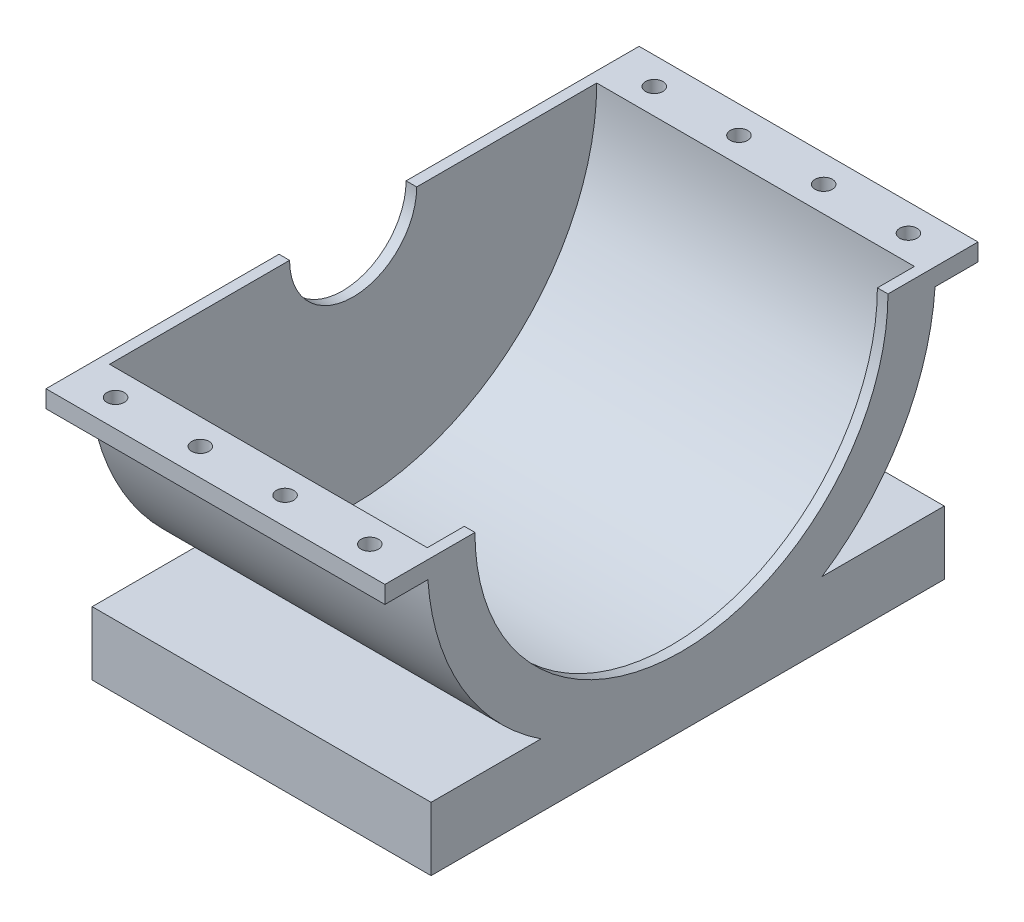
ISO-10303-21;
HEADER;
FILE_DESCRIPTION(('STEP AP214'),'2;1');
FILE_NAME('part.step','',(''),(''),'','','');
FILE_SCHEMA(('AUTOMOTIVE_DESIGN { 1 0 10303 214 1 1 1 1 }'));
ENDSEC;
DATA;
#1=APPLICATION_CONTEXT('core data for automotive mechanical design processes');
#2=APPLICATION_PROTOCOL_DEFINITION('international standard','automotive_design',2000,#1);
#3=PRODUCT_CONTEXT('',#1,'mechanical');
#4=PRODUCT('Part','Part','',(#3));
#5=PRODUCT_RELATED_PRODUCT_CATEGORY('part','',(#4));
#6=PRODUCT_DEFINITION_FORMATION('','',#4);
#7=PRODUCT_DEFINITION_CONTEXT('part definition',#1,'design');
#8=PRODUCT_DEFINITION('design','',#6,#7);
#9=PRODUCT_DEFINITION_SHAPE('','',#8);
#10=(LENGTH_UNIT() NAMED_UNIT(*) SI_UNIT(.MILLI.,.METRE.));
#11=(NAMED_UNIT(*) PLANE_ANGLE_UNIT() SI_UNIT($,.RADIAN.));
#12=(NAMED_UNIT(*) SI_UNIT($,.STERADIAN.) SOLID_ANGLE_UNIT());
#13=UNCERTAINTY_MEASURE_WITH_UNIT(LENGTH_MEASURE(1.E-05),#10,'distance_accuracy_value','');
#14=(GEOMETRIC_REPRESENTATION_CONTEXT(3) GLOBAL_UNCERTAINTY_ASSIGNED_CONTEXT((#13)) GLOBAL_UNIT_ASSIGNED_CONTEXT((#10,
#11,#12)) REPRESENTATION_CONTEXT('',''));
#15=CARTESIAN_POINT('',(0.,0.,0.));
#16=DIRECTION('',(0.,0.,1.));
#17=DIRECTION('',(1.,0.,0.));
#18=AXIS2_PLACEMENT_3D('',#15,#16,#17);
#19=CARTESIAN_POINT('',(4.,0.,0.));
#20=DIRECTION('',(0.,1.,0.));
#21=DIRECTION('',(0.,0.,1.));
#22=AXIS2_PLACEMENT_3D('',#19,#20,#21);
#23=PLANE('',#22);
#24=CARTESIAN_POINT('',(3.,0.,6.35740089209353));
#25=DIRECTION('',(0.,-1.,0.));
#26=DIRECTION('',(0.,0.,-1.));
#27=AXIS2_PLACEMENT_3D('',#24,#25,#26);
#28=CIRCLE('',#27,0.205);
#29=CARTESIAN_POINT('',(3.,0.,6.15240089209353));
#30=VERTEX_POINT('',#29);
#31=EDGE_CURVE('E310',#30,#30,#28,.T.);
#32=ORIENTED_EDGE('',*,*,#31,.T.);
#33=EDGE_LOOP('',(#32));
#34=FACE_BOUND('',#33,.T.);
#35=CARTESIAN_POINT('',(1.,0.,6.35740089209352));
#36=DIRECTION('',(0.,-1.,0.));
#37=DIRECTION('',(0.,0.,-1.));
#38=AXIS2_PLACEMENT_3D('',#35,#36,#37);
#39=CIRCLE('',#38,0.205);
#40=CARTESIAN_POINT('',(1.,0.,6.15240089209352));
#41=VERTEX_POINT('',#40);
#42=EDGE_CURVE('E345',#41,#41,#39,.T.);
#43=ORIENTED_EDGE('',*,*,#42,.T.);
#44=EDGE_LOOP('',(#43));
#45=FACE_BOUND('',#44,.T.);
#46=CARTESIAN_POINT('',(-1.,0.,6.35740089209351));
#47=DIRECTION('',(0.,-1.,0.));
#48=DIRECTION('',(0.,0.,-1.));
#49=AXIS2_PLACEMENT_3D('',#46,#47,#48);
#50=CIRCLE('',#49,0.205);
#51=CARTESIAN_POINT('',(-1.,0.,6.15240089209351));
#52=VERTEX_POINT('',#51);
#53=EDGE_CURVE('E339',#52,#52,#50,.T.);
#54=ORIENTED_EDGE('',*,*,#53,.T.);
#55=EDGE_LOOP('',(#54));
#56=FACE_BOUND('',#55,.T.);
#57=CARTESIAN_POINT('',(-3.,0.,6.35740089209349));
#58=DIRECTION('',(0.,-1.,0.));
#59=DIRECTION('',(0.,0.,-1.));
#60=AXIS2_PLACEMENT_3D('',#57,#58,#59);
#61=CIRCLE('',#60,0.205);
#62=CARTESIAN_POINT('',(-3.,0.,6.15240089209349));
#63=VERTEX_POINT('',#62);
#64=EDGE_CURVE('E333',#63,#63,#61,.T.);
#65=ORIENTED_EDGE('',*,*,#64,.T.);
#66=EDGE_LOOP('',(#65));
#67=FACE_BOUND('',#66,.T.);
#68=DIRECTION('',(1.,0.,0.));
#69=VECTOR('',#68,1.);
#70=CARTESIAN_POINT('',(-4.001,0.,1.5));
#71=LINE('',#70,#69);
#72=CARTESIAN_POINT('',(-4.,0.,1.5));
#73=VERTEX_POINT('',#72);
#74=CARTESIAN_POINT('',(-3.75,0.,1.5));
#75=VERTEX_POINT('',#74);
#76=EDGE_CURVE('E54',#73,#75,#71,.T.);
#77=ORIENTED_EDGE('',*,*,#76,.F.);
#78=DIRECTION('',(0.,0.,-1.));
#79=VECTOR('',#78,1.);
#80=CARTESIAN_POINT('',(-4.,0.,0.));
#81=LINE('',#80,#79);
#82=CARTESIAN_POINT('',(-4.,0.,7.));
#83=VERTEX_POINT('',#82);
#84=EDGE_CURVE('E179',#83,#73,#81,.T.);
#85=ORIENTED_EDGE('',*,*,#84,.F.);
#86=DIRECTION('',(-1.,0.,0.));
#87=VECTOR('',#86,1.);
#88=CARTESIAN_POINT('',(4.,0.,7.));
#89=LINE('',#88,#87);
#90=CARTESIAN_POINT('',(4.,0.,7.));
#91=VERTEX_POINT('',#90);
#92=EDGE_CURVE('E229',#91,#83,#89,.T.);
#93=ORIENTED_EDGE('',*,*,#92,.F.);
#94=DIRECTION('',(0.,0.,-1.));
#95=VECTOR('',#94,1.);
#96=CARTESIAN_POINT('',(4.,0.,0.));
#97=LINE('',#96,#95);
#98=CARTESIAN_POINT('',(4.,0.,4.875));
#99=VERTEX_POINT('',#98);
#100=EDGE_CURVE('E268',#91,#99,#97,.T.);
#101=ORIENTED_EDGE('',*,*,#100,.T.);
#102=DIRECTION('',(1.,0.,0.));
#103=VECTOR('',#102,1.);
#104=CARTESIAN_POINT('',(-4.001,0.,4.875));
#105=LINE('',#104,#103);
#106=CARTESIAN_POINT('',(3.75,0.,4.875));
#107=VERTEX_POINT('',#106);
#108=EDGE_CURVE('E293',#107,#99,#105,.T.);
#109=ORIENTED_EDGE('',*,*,#108,.F.);
#110=DIRECTION('',(0.,0.,1.));
#111=VECTOR('',#110,1.);
#112=CARTESIAN_POINT('',(3.75,0.,5.75));
#113=LINE('',#112,#111);
#114=CARTESIAN_POINT('',(3.75,0.,5.75));
#115=VERTEX_POINT('',#114);
#116=EDGE_CURVE('E290',#107,#115,#113,.T.);
#117=ORIENTED_EDGE('',*,*,#116,.T.);
#118=DIRECTION('',(1.,0.,0.));
#119=VECTOR('',#118,1.);
#120=CARTESIAN_POINT('',(-3.75,0.,5.75));
#121=LINE('',#120,#119);
#122=CARTESIAN_POINT('',(-3.75,0.,5.75));
#123=VERTEX_POINT('',#122);
#124=EDGE_CURVE('E252',#123,#115,#121,.T.);
#125=ORIENTED_EDGE('',*,*,#124,.F.);
#126=DIRECTION('',(0.,0.,1.));
#127=VECTOR('',#126,1.);
#128=CARTESIAN_POINT('',(-3.75,0.,5.75));
#129=LINE('',#128,#127);
#130=EDGE_CURVE('E295',#75,#123,#129,.T.);
#131=ORIENTED_EDGE('',*,*,#130,.F.);
#132=EDGE_LOOP('',(#77,#85,#93,#101,#109,#117,#125,#131));
#133=FACE_BOUND('',#132,.T.);
#134=ADVANCED_FACE('F39',(#34,#45,#56,#67,#133),#23,.T.);
#135=CARTESIAN_POINT('',(3.,0.,-6.35740089209353));
#136=DIRECTION('',(0.,1.,0.));
#137=DIRECTION('',(0.,0.,1.));
#138=AXIS2_PLACEMENT_3D('',#135,#136,#137);
#139=CIRCLE('',#138,0.205);
#140=CARTESIAN_POINT('',(3.,0.,-6.15240089209353));
#141=VERTEX_POINT('',#140);
#142=EDGE_CURVE('E325',#141,#141,#139,.T.);
#143=ORIENTED_EDGE('',*,*,#142,.F.);
#144=EDGE_LOOP('',(#143));
#145=FACE_BOUND('',#144,.T.);
#146=CARTESIAN_POINT('',(1.,0.,-6.35740089209352));
#147=DIRECTION('',(0.,1.,0.));
#148=DIRECTION('',(0.,0.,1.));
#149=AXIS2_PLACEMENT_3D('',#146,#147,#148);
#150=CIRCLE('',#149,0.205);
#151=CARTESIAN_POINT('',(1.,0.,-6.15240089209352));
#152=VERTEX_POINT('',#151);
#153=EDGE_CURVE('E322',#152,#152,#150,.T.);
#154=ORIENTED_EDGE('',*,*,#153,.F.);
#155=EDGE_LOOP('',(#154));
#156=FACE_BOUND('',#155,.T.);
#157=CARTESIAN_POINT('',(-1.,0.,-6.35740089209351));
#158=DIRECTION('',(0.,1.,0.));
#159=DIRECTION('',(0.,0.,1.));
#160=AXIS2_PLACEMENT_3D('',#157,#158,#159);
#161=CIRCLE('',#160,0.205);
#162=CARTESIAN_POINT('',(-1.,0.,-6.15240089209351));
#163=VERTEX_POINT('',#162);
#164=EDGE_CURVE('E316',#163,#163,#161,.T.);
#165=ORIENTED_EDGE('',*,*,#164,.F.);
#166=EDGE_LOOP('',(#165));
#167=FACE_BOUND('',#166,.T.);
#168=CARTESIAN_POINT('',(-3.,0.,-6.35740089209349));
#169=DIRECTION('',(0.,1.,0.));
#170=DIRECTION('',(0.,0.,1.));
#171=AXIS2_PLACEMENT_3D('',#168,#169,#170);
#172=CIRCLE('',#171,0.205);
#173=CARTESIAN_POINT('',(-3.,0.,-6.15240089209349));
#174=VERTEX_POINT('',#173);
#175=EDGE_CURVE('E309',#174,#174,#172,.T.);
#176=ORIENTED_EDGE('',*,*,#175,.F.);
#177=EDGE_LOOP('',(#176));
#178=FACE_BOUND('',#177,.T.);
#179=DIRECTION('',(1.,0.,0.));
#180=VECTOR('',#179,1.);
#181=CARTESIAN_POINT('',(-4.001,0.,-1.5));
#182=LINE('',#181,#180);
#183=CARTESIAN_POINT('',(-4.,0.,-1.5));
#184=VERTEX_POINT('',#183);
#185=CARTESIAN_POINT('',(-3.75,0.,-1.5));
#186=VERTEX_POINT('',#185);
#187=EDGE_CURVE('E161',#184,#186,#182,.T.);
#188=ORIENTED_EDGE('',*,*,#187,.T.);
#189=CARTESIAN_POINT('',(-3.75,0.,-5.75));
#190=VERTEX_POINT('',#189);
#191=EDGE_CURVE('E283',#190,#186,#129,.T.);
#192=ORIENTED_EDGE('',*,*,#191,.F.);
#193=DIRECTION('',(1.,0.,0.));
#194=VECTOR('',#193,1.);
#195=CARTESIAN_POINT('',(-3.75,0.,-5.75));
#196=LINE('',#195,#194);
#197=CARTESIAN_POINT('',(3.75,0.,-5.75));
#198=VERTEX_POINT('',#197);
#199=EDGE_CURVE('E280',#190,#198,#196,.T.);
#200=ORIENTED_EDGE('',*,*,#199,.T.);
#201=CARTESIAN_POINT('',(3.75,0.,-4.875));
#202=VERTEX_POINT('',#201);
#203=EDGE_CURVE('E286',#198,#202,#113,.T.);
#204=ORIENTED_EDGE('',*,*,#203,.T.);
#205=DIRECTION('',(1.,0.,0.));
#206=VECTOR('',#205,1.);
#207=CARTESIAN_POINT('',(-4.001,0.,-4.875));
#208=LINE('',#207,#206);
#209=CARTESIAN_POINT('',(4.,0.,-4.875));
#210=VERTEX_POINT('',#209);
#211=EDGE_CURVE('E62',#202,#210,#208,.T.);
#212=ORIENTED_EDGE('',*,*,#211,.T.);
#213=CARTESIAN_POINT('',(4.,0.,-7.));
#214=VERTEX_POINT('',#213);
#215=EDGE_CURVE('E271',#210,#214,#97,.T.);
#216=ORIENTED_EDGE('',*,*,#215,.T.);
#217=DIRECTION('',(-1.,0.,0.));
#218=VECTOR('',#217,1.);
#219=CARTESIAN_POINT('',(4.,0.,-7.));
#220=LINE('',#219,#218);
#221=CARTESIAN_POINT('',(-4.,0.,-7.));
#222=VERTEX_POINT('',#221);
#223=EDGE_CURVE('E184',#214,#222,#220,.T.);
#224=ORIENTED_EDGE('',*,*,#223,.T.);
#225=EDGE_CURVE('E175',#184,#222,#81,.T.);
#226=ORIENTED_EDGE('',*,*,#225,.F.);
#227=EDGE_LOOP('',(#188,#192,#200,#204,#212,#216,#224,#226));
#228=FACE_BOUND('',#227,.T.);
#229=ADVANCED_FACE('F182',(#145,#156,#167,#178,#228),#23,.T.);
#230=CARTESIAN_POINT('',(4.,-5.,0.));
#231=DIRECTION('',(0.,1.,0.));
#232=DIRECTION('',(0.,0.,1.));
#233=AXIS2_PLACEMENT_3D('',#230,#231,#232);
#234=PLANE('',#233);
#235=DIRECTION('',(0.,0.,-1.));
#236=VECTOR('',#235,1.);
#237=CARTESIAN_POINT('',(-4.,-5.,0.));
#238=LINE('',#237,#236);
#239=CARTESIAN_POINT('',(-4.,-5.,-3.3166247903554));
#240=VERTEX_POINT('',#239);
#241=CARTESIAN_POINT('',(-4.,-5.,-6.20359281437126));
#242=VERTEX_POINT('',#241);
#243=EDGE_CURVE('E248',#240,#242,#238,.T.);
#244=ORIENTED_EDGE('',*,*,#243,.F.);
#245=DIRECTION('',(-1.,0.,0.));
#246=VECTOR('',#245,1.);
#247=CARTESIAN_POINT('',(4.,-5.,-3.3166247903554));
#248=LINE('',#247,#246);
#249=CARTESIAN_POINT('',(4.,-5.,-3.3166247903554));
#250=VERTEX_POINT('',#249);
#251=EDGE_CURVE('E11',#250,#240,#248,.T.);
#252=ORIENTED_EDGE('',*,*,#251,.F.);
#253=DIRECTION('',(0.,0.,-1.));
#254=VECTOR('',#253,1.);
#255=CARTESIAN_POINT('',(4.,-5.,0.));
#256=LINE('',#255,#254);
#257=CARTESIAN_POINT('',(4.,-5.,-6.20359281437126));
#258=VERTEX_POINT('',#257);
#259=EDGE_CURVE('E210',#250,#258,#256,.T.);
#260=ORIENTED_EDGE('',*,*,#259,.T.);
#261=DIRECTION('',(-1.,0.,0.));
#262=VECTOR('',#261,1.);
#263=CARTESIAN_POINT('',(4.,-5.,-6.20359281437126));
#264=LINE('',#263,#262);
#265=EDGE_CURVE('E211',#258,#242,#264,.T.);
#266=ORIENTED_EDGE('',*,*,#265,.T.);
#267=EDGE_LOOP('',(#244,#252,#260,#266));
#268=FACE_BOUND('',#267,.T.);
#269=ADVANCED_FACE('F41',(#268),#234,.T.);
#270=CARTESIAN_POINT('',(4.,0.,0.));
#271=DIRECTION('',(-1.,0.,0.));
#272=DIRECTION('',(0.,0.,1.));
#273=AXIS2_PLACEMENT_3D('',#270,#271,#272);
#274=CYLINDRICAL_SURFACE('',#273,6.);
#275=CARTESIAN_POINT('',(-4.,0.,0.));
#276=DIRECTION('',(1.,0.,0.));
#277=DIRECTION('',(0.,0.,-1.));
#278=AXIS2_PLACEMENT_3D('',#275,#276,#277);
#279=CIRCLE('',#278,6.);
#280=CARTESIAN_POINT('',(-4.,-0.41,-5.98597527559211));
#281=VERTEX_POINT('',#280);
#282=EDGE_CURVE('E246',#240,#281,#279,.T.);
#283=ORIENTED_EDGE('',*,*,#282,.T.);
#284=DIRECTION('',(-1.,0.,0.));
#285=VECTOR('',#284,1.);
#286=CARTESIAN_POINT('',(4.,-0.41,-5.98597527559211));
#287=LINE('',#286,#285);
#288=CARTESIAN_POINT('',(4.,-0.41,-5.98597527559211));
#289=VERTEX_POINT('',#288);
#290=EDGE_CURVE('E47',#289,#281,#287,.T.);
#291=ORIENTED_EDGE('',*,*,#290,.F.);
#292=CARTESIAN_POINT('',(4.,0.,0.));
#293=DIRECTION('',(1.,0.,0.));
#294=DIRECTION('',(0.,0.,-1.));
#295=AXIS2_PLACEMENT_3D('',#292,#293,#294);
#296=CIRCLE('',#295,6.);
#297=EDGE_CURVE('E276',#250,#289,#296,.T.);
#298=ORIENTED_EDGE('',*,*,#297,.F.);
#299=ORIENTED_EDGE('',*,*,#251,.T.);
#300=EDGE_LOOP('',(#283,#291,#298,#299));
#301=FACE_BOUND('',#300,.T.);
#302=ADVANCED_FACE('F423',(#301),#274,.T.);
#303=CARTESIAN_POINT('',(4.,-0.41,0.));
#304=DIRECTION('',(0.,1.,0.));
#305=DIRECTION('',(0.,0.,1.));
#306=AXIS2_PLACEMENT_3D('',#303,#304,#305);
#307=PLANE('',#306);
#308=CARTESIAN_POINT('',(3.,-0.41,-6.35740089209353));
#309=DIRECTION('',(0.,1.,0.));
#310=DIRECTION('',(0.,0.,1.));
#311=AXIS2_PLACEMENT_3D('',#308,#309,#310);
#312=CIRCLE('',#311,0.205);
#313=CARTESIAN_POINT('',(3.,-0.41,-6.15240089209353));
#314=VERTEX_POINT('',#313);
#315=EDGE_CURVE('E180',#314,#314,#312,.F.);
#316=ORIENTED_EDGE('',*,*,#315,.F.);
#317=EDGE_LOOP('',(#316));
#318=FACE_BOUND('',#317,.T.);
#319=CARTESIAN_POINT('',(1.,-0.41,-6.35740089209352));
#320=DIRECTION('',(0.,1.,0.));
#321=DIRECTION('',(0.,0.,1.));
#322=AXIS2_PLACEMENT_3D('',#319,#320,#321);
#323=CIRCLE('',#322,0.205);
#324=CARTESIAN_POINT('',(1.,-0.41,-6.15240089209352));
#325=VERTEX_POINT('',#324);
#326=EDGE_CURVE('E319',#325,#325,#323,.F.);
#327=ORIENTED_EDGE('',*,*,#326,.F.);
#328=EDGE_LOOP('',(#327));
#329=FACE_BOUND('',#328,.T.);
#330=CARTESIAN_POINT('',(-1.,-0.41,-6.35740089209351));
#331=DIRECTION('',(0.,1.,0.));
#332=DIRECTION('',(0.,0.,1.));
#333=AXIS2_PLACEMENT_3D('',#330,#331,#332);
#334=CIRCLE('',#333,0.205);
#335=CARTESIAN_POINT('',(-1.,-0.41,-6.15240089209351));
#336=VERTEX_POINT('',#335);
#337=EDGE_CURVE('E313',#336,#336,#334,.F.);
#338=ORIENTED_EDGE('',*,*,#337,.F.);
#339=EDGE_LOOP('',(#338));
#340=FACE_BOUND('',#339,.T.);
#341=CARTESIAN_POINT('',(-3.,-0.41,-6.35740089209349));
#342=DIRECTION('',(0.,1.,0.));
#343=DIRECTION('',(0.,0.,1.));
#344=AXIS2_PLACEMENT_3D('',#341,#342,#343);
#345=CIRCLE('',#344,0.205);
#346=CARTESIAN_POINT('',(-3.,-0.41,-6.15240089209349));
#347=VERTEX_POINT('',#346);
#348=EDGE_CURVE('E306',#347,#347,#345,.F.);
#349=ORIENTED_EDGE('',*,*,#348,.F.);
#350=EDGE_LOOP('',(#349));
#351=FACE_BOUND('',#350,.T.);
#352=DIRECTION('',(0.,0.,-1.));
#353=VECTOR('',#352,1.);
#354=CARTESIAN_POINT('',(-4.,-0.41,0.));
#355=LINE('',#354,#353);
#356=CARTESIAN_POINT('',(-4.,-0.41,-7.));
#357=VERTEX_POINT('',#356);
#358=EDGE_CURVE('E189',#281,#357,#355,.T.);
#359=ORIENTED_EDGE('',*,*,#358,.T.);
#360=DIRECTION('',(-1.,0.,0.));
#361=VECTOR('',#360,1.);
#362=CARTESIAN_POINT('',(4.,-0.41,-7.));
#363=LINE('',#362,#361);
#364=CARTESIAN_POINT('',(4.,-0.41,-7.));
#365=VERTEX_POINT('',#364);
#366=EDGE_CURVE('E232',#365,#357,#363,.T.);
#367=ORIENTED_EDGE('',*,*,#366,.F.);
#368=DIRECTION('',(0.,0.,-1.));
#369=VECTOR('',#368,1.);
#370=CARTESIAN_POINT('',(4.,-0.41,0.));
#371=LINE('',#370,#369);
#372=EDGE_CURVE('E241',#289,#365,#371,.T.);
#373=ORIENTED_EDGE('',*,*,#372,.F.);
#374=ORIENTED_EDGE('',*,*,#290,.T.);
#375=EDGE_LOOP('',(#359,#367,#373,#374));
#376=FACE_BOUND('',#375,.T.);
#377=ADVANCED_FACE('F239',(#318,#329,#340,#351,#376),#307,.F.);
#378=CARTESIAN_POINT('',(4.,0.,-7.));
#379=DIRECTION('',(0.,0.,1.));
#380=DIRECTION('',(1.,0.,0.));
#381=AXIS2_PLACEMENT_3D('',#378,#379,#380);
#382=PLANE('',#381);
#383=DIRECTION('',(0.,1.,0.));
#384=VECTOR('',#383,1.);
#385=CARTESIAN_POINT('',(-4.,0.,-7.));
#386=LINE('',#385,#384);
#387=EDGE_CURVE('E186',#357,#222,#386,.T.);
#388=ORIENTED_EDGE('',*,*,#387,.T.);
#389=ORIENTED_EDGE('',*,*,#223,.F.);
#390=DIRECTION('',(0.,1.,0.));
#391=VECTOR('',#390,1.);
#392=CARTESIAN_POINT('',(4.,0.,-7.));
#393=LINE('',#392,#391);
#394=EDGE_CURVE('E272',#365,#214,#393,.T.);
#395=ORIENTED_EDGE('',*,*,#394,.F.);
#396=ORIENTED_EDGE('',*,*,#366,.T.);
#397=EDGE_LOOP('',(#388,#389,#395,#396));
#398=FACE_BOUND('',#397,.T.);
#399=ADVANCED_FACE('F415',(#398),#382,.F.);
#400=CARTESIAN_POINT('',(4.,0.,7.));
#401=DIRECTION('',(0.,0.,-1.));
#402=DIRECTION('',(-1.,0.,0.));
#403=AXIS2_PLACEMENT_3D('',#400,#401,#402);
#404=PLANE('',#403);
#405=DIRECTION('',(0.,-1.,0.));
#406=VECTOR('',#405,1.);
#407=CARTESIAN_POINT('',(-4.,0.,7.));
#408=LINE('',#407,#406);
#409=CARTESIAN_POINT('',(-4.,-0.41,7.));
#410=VERTEX_POINT('',#409);
#411=EDGE_CURVE('E188',#83,#410,#408,.T.);
#412=ORIENTED_EDGE('',*,*,#411,.T.);
#413=DIRECTION('',(-1.,0.,0.));
#414=VECTOR('',#413,1.);
#415=CARTESIAN_POINT('',(4.,-0.41,7.));
#416=LINE('',#415,#414);
#417=CARTESIAN_POINT('',(4.,-0.41,7.));
#418=VERTEX_POINT('',#417);
#419=EDGE_CURVE('E226',#418,#410,#416,.T.);
#420=ORIENTED_EDGE('',*,*,#419,.F.);
#421=DIRECTION('',(0.,-1.,0.));
#422=VECTOR('',#421,1.);
#423=CARTESIAN_POINT('',(4.,0.,7.));
#424=LINE('',#423,#422);
#425=EDGE_CURVE('E266',#91,#418,#424,.T.);
#426=ORIENTED_EDGE('',*,*,#425,.F.);
#427=ORIENTED_EDGE('',*,*,#92,.T.);
#428=EDGE_LOOP('',(#412,#420,#426,#427));
#429=FACE_BOUND('',#428,.T.);
#430=ADVANCED_FACE('F367',(#429),#404,.F.);
#431=CARTESIAN_POINT('',(4.,-0.41,0.));
#432=DIRECTION('',(0.,1.,0.));
#433=DIRECTION('',(0.,0.,1.));
#434=AXIS2_PLACEMENT_3D('',#431,#432,#433);
#435=PLANE('',#434);
#436=CARTESIAN_POINT('',(3.,-0.41,6.35740089209353));
#437=DIRECTION('',(0.,1.,0.));
#438=DIRECTION('',(0.,0.,1.));
#439=AXIS2_PLACEMENT_3D('',#436,#437,#438);
#440=CIRCLE('',#439,0.205);
#441=CARTESIAN_POINT('',(3.,-0.41,6.56240089209353));
#442=VERTEX_POINT('',#441);
#443=EDGE_CURVE('E348',#442,#442,#440,.T.);
#444=ORIENTED_EDGE('',*,*,#443,.T.);
#445=EDGE_LOOP('',(#444));
#446=FACE_BOUND('',#445,.T.);
#447=CARTESIAN_POINT('',(1.,-0.41,6.35740089209352));
#448=DIRECTION('',(0.,1.,0.));
#449=DIRECTION('',(0.,0.,1.));
#450=AXIS2_PLACEMENT_3D('',#447,#448,#449);
#451=CIRCLE('',#450,0.205);
#452=CARTESIAN_POINT('',(1.,-0.41,6.56240089209352));
#453=VERTEX_POINT('',#452);
#454=EDGE_CURVE('E342',#453,#453,#451,.T.);
#455=ORIENTED_EDGE('',*,*,#454,.T.);
#456=EDGE_LOOP('',(#455));
#457=FACE_BOUND('',#456,.T.);
#458=CARTESIAN_POINT('',(-1.,-0.41,6.35740089209351));
#459=DIRECTION('',(0.,1.,0.));
#460=DIRECTION('',(0.,0.,1.));
#461=AXIS2_PLACEMENT_3D('',#458,#459,#460);
#462=CIRCLE('',#461,0.205);
#463=CARTESIAN_POINT('',(-1.,-0.41,6.56240089209351));
#464=VERTEX_POINT('',#463);
#465=EDGE_CURVE('E336',#464,#464,#462,.T.);
#466=ORIENTED_EDGE('',*,*,#465,.T.);
#467=EDGE_LOOP('',(#466));
#468=FACE_BOUND('',#467,.T.);
#469=CARTESIAN_POINT('',(-3.,-0.41,6.35740089209349));
#470=DIRECTION('',(0.,1.,0.));
#471=DIRECTION('',(0.,0.,1.));
#472=AXIS2_PLACEMENT_3D('',#469,#470,#471);
#473=CIRCLE('',#472,0.205);
#474=CARTESIAN_POINT('',(-3.,-0.41,6.56240089209349));
#475=VERTEX_POINT('',#474);
#476=EDGE_CURVE('E330',#475,#475,#473,.T.);
#477=ORIENTED_EDGE('',*,*,#476,.T.);
#478=EDGE_LOOP('',(#477));
#479=FACE_BOUND('',#478,.T.);
#480=DIRECTION('',(0.,0.,-1.));
#481=VECTOR('',#480,1.);
#482=CARTESIAN_POINT('',(-4.,-0.41,0.));
#483=LINE('',#482,#481);
#484=CARTESIAN_POINT('',(-4.,-0.41,5.98597527559211));
#485=VERTEX_POINT('',#484);
#486=EDGE_CURVE('E194',#410,#485,#483,.T.);
#487=ORIENTED_EDGE('',*,*,#486,.T.);
#488=DIRECTION('',(-1.,0.,0.));
#489=VECTOR('',#488,1.);
#490=CARTESIAN_POINT('',(4.,-0.41,5.98597527559211));
#491=LINE('',#490,#489);
#492=CARTESIAN_POINT('',(4.,-0.41,5.98597527559211));
#493=VERTEX_POINT('',#492);
#494=EDGE_CURVE('E223',#493,#485,#491,.T.);
#495=ORIENTED_EDGE('',*,*,#494,.F.);
#496=DIRECTION('',(0.,0.,-1.));
#497=VECTOR('',#496,1.);
#498=CARTESIAN_POINT('',(4.,-0.41,0.));
#499=LINE('',#498,#497);
#500=EDGE_CURVE('E264',#418,#493,#499,.T.);
#501=ORIENTED_EDGE('',*,*,#500,.F.);
#502=ORIENTED_EDGE('',*,*,#419,.T.);
#503=EDGE_LOOP('',(#487,#495,#501,#502));
#504=FACE_BOUND('',#503,.T.);
#505=ADVANCED_FACE('F363',(#446,#457,#468,#479,#504),#435,.F.);
#506=CARTESIAN_POINT('',(4.,0.,0.));
#507=DIRECTION('',(-1.,0.,0.));
#508=DIRECTION('',(0.,0.,1.));
#509=AXIS2_PLACEMENT_3D('',#506,#507,#508);
#510=CYLINDRICAL_SURFACE('',#509,6.);
#511=CARTESIAN_POINT('',(-4.,0.,0.));
#512=DIRECTION('',(1.,0.,0.));
#513=DIRECTION('',(0.,0.,-1.));
#514=AXIS2_PLACEMENT_3D('',#511,#512,#513);
#515=CIRCLE('',#514,6.);
#516=CARTESIAN_POINT('',(-4.,-5.,3.3166247903554));
#517=VERTEX_POINT('',#516);
#518=EDGE_CURVE('E196',#485,#517,#515,.T.);
#519=ORIENTED_EDGE('',*,*,#518,.T.);
#520=DIRECTION('',(-1.,0.,0.));
#521=VECTOR('',#520,1.);
#522=CARTESIAN_POINT('',(4.,-5.,3.3166247903554));
#523=LINE('',#522,#521);
#524=CARTESIAN_POINT('',(4.,-5.,3.3166247903554));
#525=VERTEX_POINT('',#524);
#526=EDGE_CURVE('E221',#525,#517,#523,.T.);
#527=ORIENTED_EDGE('',*,*,#526,.F.);
#528=CARTESIAN_POINT('',(4.,0.,0.));
#529=DIRECTION('',(1.,0.,0.));
#530=DIRECTION('',(0.,0.,-1.));
#531=AXIS2_PLACEMENT_3D('',#528,#529,#530);
#532=CIRCLE('',#531,6.);
#533=EDGE_CURVE('E262',#493,#525,#532,.T.);
#534=ORIENTED_EDGE('',*,*,#533,.F.);
#535=ORIENTED_EDGE('',*,*,#494,.T.);
#536=EDGE_LOOP('',(#519,#527,#534,#535));
#537=FACE_BOUND('',#536,.T.);
#538=ADVANCED_FACE('F366',(#537),#510,.T.);
#539=CARTESIAN_POINT('',(4.,-5.,0.));
#540=DIRECTION('',(0.,1.,0.));
#541=DIRECTION('',(0.,0.,1.));
#542=AXIS2_PLACEMENT_3D('',#539,#540,#541);
#543=PLANE('',#542);
#544=DIRECTION('',(0.,0.,-1.));
#545=VECTOR('',#544,1.);
#546=CARTESIAN_POINT('',(-4.,-5.,0.));
#547=LINE('',#546,#545);
#548=CARTESIAN_POINT('',(-4.,-5.,5.91017964071856));
#549=VERTEX_POINT('',#548);
#550=EDGE_CURVE('E199',#549,#517,#547,.T.);
#551=ORIENTED_EDGE('',*,*,#550,.F.);
#552=DIRECTION('',(-1.,0.,0.));
#553=VECTOR('',#552,1.);
#554=CARTESIAN_POINT('',(4.,-5.,5.91017964071856));
#555=LINE('',#554,#553);
#556=CARTESIAN_POINT('',(4.,-5.,5.91017964071856));
#557=VERTEX_POINT('',#556);
#558=EDGE_CURVE('E219',#557,#549,#555,.T.);
#559=ORIENTED_EDGE('',*,*,#558,.F.);
#560=DIRECTION('',(0.,0.,-1.));
#561=VECTOR('',#560,1.);
#562=CARTESIAN_POINT('',(4.,-5.,0.));
#563=LINE('',#562,#561);
#564=EDGE_CURVE('E259',#557,#525,#563,.T.);
#565=ORIENTED_EDGE('',*,*,#564,.T.);
#566=ORIENTED_EDGE('',*,*,#526,.T.);
#567=EDGE_LOOP('',(#551,#559,#565,#566));
#568=FACE_BOUND('',#567,.T.);
#569=ADVANCED_FACE('F387',(#568),#543,.T.);
#570=CARTESIAN_POINT('',(4.,0.,5.91017964071856));
#571=DIRECTION('',(0.,0.,-1.));
#572=DIRECTION('',(-1.,0.,0.));
#573=AXIS2_PLACEMENT_3D('',#570,#571,#572);
#574=PLANE('',#573);
#575=DIRECTION('',(0.,-1.,0.));
#576=VECTOR('',#575,1.);
#577=CARTESIAN_POINT('',(-4.,0.,5.91017964071856));
#578=LINE('',#577,#576);
#579=CARTESIAN_POINT('',(-4.,-6.5,5.91017964071856));
#580=VERTEX_POINT('',#579);
#581=EDGE_CURVE('E202',#549,#580,#578,.T.);
#582=ORIENTED_EDGE('',*,*,#581,.T.);
#583=DIRECTION('',(-1.,0.,0.));
#584=VECTOR('',#583,1.);
#585=CARTESIAN_POINT('',(4.,-6.5,5.91017964071856));
#586=LINE('',#585,#584);
#587=CARTESIAN_POINT('',(4.,-6.5,5.91017964071856));
#588=VERTEX_POINT('',#587);
#589=EDGE_CURVE('E216',#588,#580,#586,.T.);
#590=ORIENTED_EDGE('',*,*,#589,.F.);
#591=DIRECTION('',(0.,-1.,0.));
#592=VECTOR('',#591,1.);
#593=CARTESIAN_POINT('',(4.,0.,5.91017964071856));
#594=LINE('',#593,#592);
#595=EDGE_CURVE('E257',#557,#588,#594,.T.);
#596=ORIENTED_EDGE('',*,*,#595,.F.);
#597=ORIENTED_EDGE('',*,*,#558,.T.);
#598=EDGE_LOOP('',(#582,#590,#596,#597));
#599=FACE_BOUND('',#598,.T.);
#600=ADVANCED_FACE('F437',(#599),#574,.F.);
#601=CARTESIAN_POINT('',(4.,-6.5,0.));
#602=DIRECTION('',(0.,1.,0.));
#603=DIRECTION('',(0.,0.,1.));
#604=AXIS2_PLACEMENT_3D('',#601,#602,#603);
#605=PLANE('',#604);
#606=DIRECTION('',(0.,0.,-1.));
#607=VECTOR('',#606,1.);
#608=CARTESIAN_POINT('',(-4.,-6.5,0.));
#609=LINE('',#608,#607);
#610=CARTESIAN_POINT('',(-4.,-6.5,-6.20359281437126));
#611=VERTEX_POINT('',#610);
#612=EDGE_CURVE('E204',#580,#611,#609,.T.);
#613=ORIENTED_EDGE('',*,*,#612,.T.);
#614=DIRECTION('',(-1.,0.,0.));
#615=VECTOR('',#614,1.);
#616=CARTESIAN_POINT('',(4.,-6.5,-6.20359281437126));
#617=LINE('',#616,#615);
#618=CARTESIAN_POINT('',(4.,-6.5,-6.20359281437126));
#619=VERTEX_POINT('',#618);
#620=EDGE_CURVE('E213',#619,#611,#617,.T.);
#621=ORIENTED_EDGE('',*,*,#620,.F.);
#622=DIRECTION('',(0.,0.,-1.));
#623=VECTOR('',#622,1.);
#624=CARTESIAN_POINT('',(4.,-6.5,0.));
#625=LINE('',#624,#623);
#626=EDGE_CURVE('E255',#588,#619,#625,.T.);
#627=ORIENTED_EDGE('',*,*,#626,.F.);
#628=ORIENTED_EDGE('',*,*,#589,.T.);
#629=EDGE_LOOP('',(#613,#621,#627,#628));
#630=FACE_BOUND('',#629,.T.);
#631=ADVANCED_FACE('F440',(#630),#605,.F.);
#632=CARTESIAN_POINT('',(4.,0.,-6.20359281437126));
#633=DIRECTION('',(0.,0.,-1.));
#634=DIRECTION('',(-1.,0.,0.));
#635=AXIS2_PLACEMENT_3D('',#632,#633,#634);
#636=PLANE('',#635);
#637=DIRECTION('',(0.,-1.,0.));
#638=VECTOR('',#637,1.);
#639=CARTESIAN_POINT('',(-4.,0.,-6.20359281437126));
#640=LINE('',#639,#638);
#641=EDGE_CURVE('E207',#242,#611,#640,.T.);
#642=ORIENTED_EDGE('',*,*,#641,.F.);
#643=ORIENTED_EDGE('',*,*,#265,.F.);
#644=DIRECTION('',(0.,-1.,0.));
#645=VECTOR('',#644,1.);
#646=CARTESIAN_POINT('',(4.,0.,-6.20359281437126));
#647=LINE('',#646,#645);
#648=EDGE_CURVE('E214',#258,#619,#647,.T.);
#649=ORIENTED_EDGE('',*,*,#648,.T.);
#650=ORIENTED_EDGE('',*,*,#620,.T.);
#651=EDGE_LOOP('',(#642,#643,#649,#650));
#652=FACE_BOUND('',#651,.T.);
#653=ADVANCED_FACE('F444',(#652),#636,.T.);
#654=CARTESIAN_POINT('',(4.,0.,0.));
#655=DIRECTION('',(1.,0.,0.));
#656=DIRECTION('',(0.,0.,-1.));
#657=AXIS2_PLACEMENT_3D('',#654,#655,#656);
#658=PLANE('',#657);
#659=CARTESIAN_POINT('',(4.,0.,0.));
#660=DIRECTION('',(1.,0.,0.));
#661=DIRECTION('',(0.,0.,-1.));
#662=AXIS2_PLACEMENT_3D('',#659,#660,#661);
#663=CIRCLE('',#662,4.875);
#664=EDGE_CURVE('E299',#99,#210,#663,.T.);
#665=ORIENTED_EDGE('',*,*,#664,.F.);
#666=ORIENTED_EDGE('',*,*,#100,.F.);
#667=ORIENTED_EDGE('',*,*,#425,.T.);
#668=ORIENTED_EDGE('',*,*,#500,.T.);
#669=ORIENTED_EDGE('',*,*,#533,.T.);
#670=ORIENTED_EDGE('',*,*,#564,.F.);
#671=ORIENTED_EDGE('',*,*,#595,.T.);
#672=ORIENTED_EDGE('',*,*,#626,.T.);
#673=ORIENTED_EDGE('',*,*,#648,.F.);
#674=ORIENTED_EDGE('',*,*,#259,.F.);
#675=ORIENTED_EDGE('',*,*,#297,.T.);
#676=ORIENTED_EDGE('',*,*,#372,.T.);
#677=ORIENTED_EDGE('',*,*,#394,.T.);
#678=ORIENTED_EDGE('',*,*,#215,.F.);
#679=EDGE_LOOP('',(#665,#666,#667,#668,#669,#670,#671,#672,#673,#674,#675,#676,#677,#678));
#680=FACE_BOUND('',#679,.T.);
#681=ADVANCED_FACE('F392',(#680),#658,.T.);
#682=CARTESIAN_POINT('',(-4.,0.,0.));
#683=DIRECTION('',(1.,0.,0.));
#684=DIRECTION('',(0.,0.,-1.));
#685=AXIS2_PLACEMENT_3D('',#682,#683,#684);
#686=PLANE('',#685);
#687=ORIENTED_EDGE('',*,*,#84,.T.);
#688=CARTESIAN_POINT('',(-4.,0.,0.));
#689=DIRECTION('',(1.,0.,0.));
#690=DIRECTION('',(0.,0.,-1.));
#691=AXIS2_PLACEMENT_3D('',#688,#689,#690);
#692=CIRCLE('',#691,1.5);
#693=EDGE_CURVE('E164',#184,#73,#692,.F.);
#694=ORIENTED_EDGE('',*,*,#693,.F.);
#695=ORIENTED_EDGE('',*,*,#225,.T.);
#696=ORIENTED_EDGE('',*,*,#387,.F.);
#697=ORIENTED_EDGE('',*,*,#358,.F.);
#698=ORIENTED_EDGE('',*,*,#282,.F.);
#699=ORIENTED_EDGE('',*,*,#243,.T.);
#700=ORIENTED_EDGE('',*,*,#641,.T.);
#701=ORIENTED_EDGE('',*,*,#612,.F.);
#702=ORIENTED_EDGE('',*,*,#581,.F.);
#703=ORIENTED_EDGE('',*,*,#550,.T.);
#704=ORIENTED_EDGE('',*,*,#518,.F.);
#705=ORIENTED_EDGE('',*,*,#486,.F.);
#706=ORIENTED_EDGE('',*,*,#411,.F.);
#707=EDGE_LOOP('',(#687,#694,#695,#696,#697,#698,#699,#700,#701,#702,#703,#704,#705,#706));
#708=FACE_BOUND('',#707,.T.);
#709=ADVANCED_FACE('F173',(#708),#686,.F.);
#710=CARTESIAN_POINT('',(-3.75,0.,0.));
#711=DIRECTION('',(1.,0.,0.));
#712=DIRECTION('',(0.,0.,-1.));
#713=AXIS2_PLACEMENT_3D('',#710,#711,#712);
#714=CYLINDRICAL_SURFACE('',#713,5.75);
#715=CARTESIAN_POINT('',(3.75,0.,0.));
#716=DIRECTION('',(1.,0.,0.));
#717=DIRECTION('',(0.,0.,-1.));
#718=AXIS2_PLACEMENT_3D('',#715,#716,#717);
#719=CIRCLE('',#718,5.75);
#720=EDGE_CURVE('E291',#115,#198,#719,.T.);
#721=ORIENTED_EDGE('',*,*,#720,.T.);
#722=ORIENTED_EDGE('',*,*,#199,.F.);
#723=CARTESIAN_POINT('',(-3.75,0.,0.));
#724=DIRECTION('',(1.,0.,0.));
#725=DIRECTION('',(0.,0.,-1.));
#726=AXIS2_PLACEMENT_3D('',#723,#724,#725);
#727=CIRCLE('',#726,5.75);
#728=EDGE_CURVE('E289',#123,#190,#727,.T.);
#729=ORIENTED_EDGE('',*,*,#728,.F.);
#730=ORIENTED_EDGE('',*,*,#124,.T.);
#731=EDGE_LOOP('',(#721,#722,#729,#730));
#732=FACE_BOUND('',#731,.T.);
#733=ADVANCED_FACE('F404',(#732),#714,.F.);
#734=CARTESIAN_POINT('',(-3.75,0.,0.));
#735=DIRECTION('',(1.,0.,0.));
#736=DIRECTION('',(0.,0.,-1.));
#737=AXIS2_PLACEMENT_3D('',#734,#735,#736);
#738=PLANE('',#737);
#739=CARTESIAN_POINT('',(-3.75,0.,0.));
#740=DIRECTION('',(1.,0.,0.));
#741=DIRECTION('',(0.,0.,-1.));
#742=AXIS2_PLACEMENT_3D('',#739,#740,#741);
#743=CIRCLE('',#742,1.5);
#744=EDGE_CURVE('E165',#75,#186,#743,.T.);
#745=ORIENTED_EDGE('',*,*,#744,.F.);
#746=ORIENTED_EDGE('',*,*,#130,.T.);
#747=ORIENTED_EDGE('',*,*,#728,.T.);
#748=ORIENTED_EDGE('',*,*,#191,.T.);
#749=EDGE_LOOP('',(#745,#746,#747,#748));
#750=FACE_BOUND('',#749,.T.);
#751=ADVANCED_FACE('F402',(#750),#738,.T.);
#752=CARTESIAN_POINT('',(3.75,0.,0.));
#753=DIRECTION('',(1.,0.,0.));
#754=DIRECTION('',(0.,0.,-1.));
#755=AXIS2_PLACEMENT_3D('',#752,#753,#754);
#756=PLANE('',#755);
#757=ORIENTED_EDGE('',*,*,#116,.F.);
#758=CARTESIAN_POINT('',(3.75,0.,0.));
#759=DIRECTION('',(1.,0.,0.));
#760=DIRECTION('',(0.,0.,-1.));
#761=AXIS2_PLACEMENT_3D('',#758,#759,#760);
#762=CIRCLE('',#761,4.875);
#763=EDGE_CURVE('E302',#202,#107,#762,.F.);
#764=ORIENTED_EDGE('',*,*,#763,.F.);
#765=ORIENTED_EDGE('',*,*,#203,.F.);
#766=ORIENTED_EDGE('',*,*,#720,.F.);
#767=EDGE_LOOP('',(#757,#764,#765,#766));
#768=FACE_BOUND('',#767,.T.);
#769=ADVANCED_FACE('F410',(#768),#756,.F.);
#770=CARTESIAN_POINT('',(-4.001,0.,0.));
#771=DIRECTION('',(1.,0.,0.));
#772=DIRECTION('',(0.,0.,-1.));
#773=AXIS2_PLACEMENT_3D('',#770,#771,#772);
#774=CYLINDRICAL_SURFACE('',#773,4.875);
#775=ORIENTED_EDGE('',*,*,#763,.T.);
#776=ORIENTED_EDGE('',*,*,#108,.T.);
#777=ORIENTED_EDGE('',*,*,#664,.T.);
#778=ORIENTED_EDGE('',*,*,#211,.F.);
#779=EDGE_LOOP('',(#775,#776,#777,#778));
#780=FACE_BOUND('',#779,.T.);
#781=ADVANCED_FACE('F412',(#780),#774,.F.);
#782=CARTESIAN_POINT('',(-4.001,0.,0.));
#783=DIRECTION('',(1.,0.,0.));
#784=DIRECTION('',(0.,0.,-1.));
#785=AXIS2_PLACEMENT_3D('',#782,#783,#784);
#786=CYLINDRICAL_SURFACE('',#785,1.5);
#787=ORIENTED_EDGE('',*,*,#693,.T.);
#788=ORIENTED_EDGE('',*,*,#76,.T.);
#789=ORIENTED_EDGE('',*,*,#744,.T.);
#790=ORIENTED_EDGE('',*,*,#187,.F.);
#791=EDGE_LOOP('',(#787,#788,#789,#790));
#792=FACE_BOUND('',#791,.T.);
#793=ADVANCED_FACE('F163',(#792),#786,.F.);
#794=CARTESIAN_POINT('',(-3.,-6.501,-6.35740089209349));
#795=DIRECTION('',(0.,1.,0.));
#796=DIRECTION('',(0.,0.,1.));
#797=AXIS2_PLACEMENT_3D('',#794,#795,#796);
#798=CYLINDRICAL_SURFACE('',#797,0.205);
#799=ORIENTED_EDGE('',*,*,#175,.T.);
#800=EDGE_LOOP('',(#799));
#801=FACE_BOUND('',#800,.T.);
#802=ORIENTED_EDGE('',*,*,#348,.T.);
#803=EDGE_LOOP('',(#802));
#804=FACE_BOUND('',#803,.T.);
#805=ADVANCED_FACE('F463',(#801,#804),#798,.F.);
#806=CARTESIAN_POINT('',(-1.,-6.501,-6.35740089209351));
#807=DIRECTION('',(0.,1.,0.));
#808=DIRECTION('',(0.,0.,1.));
#809=AXIS2_PLACEMENT_3D('',#806,#807,#808);
#810=CYLINDRICAL_SURFACE('',#809,0.205);
#811=ORIENTED_EDGE('',*,*,#164,.T.);
#812=EDGE_LOOP('',(#811));
#813=FACE_BOUND('',#812,.T.);
#814=ORIENTED_EDGE('',*,*,#337,.T.);
#815=EDGE_LOOP('',(#814));
#816=FACE_BOUND('',#815,.T.);
#817=ADVANCED_FACE('F466',(#813,#816),#810,.F.);
#818=CARTESIAN_POINT('',(1.,-6.501,-6.35740089209352));
#819=DIRECTION('',(0.,1.,0.));
#820=DIRECTION('',(0.,0.,1.));
#821=AXIS2_PLACEMENT_3D('',#818,#819,#820);
#822=CYLINDRICAL_SURFACE('',#821,0.205);
#823=ORIENTED_EDGE('',*,*,#153,.T.);
#824=EDGE_LOOP('',(#823));
#825=FACE_BOUND('',#824,.T.);
#826=ORIENTED_EDGE('',*,*,#326,.T.);
#827=EDGE_LOOP('',(#826));
#828=FACE_BOUND('',#827,.T.);
#829=ADVANCED_FACE('F470',(#825,#828),#822,.F.);
#830=CARTESIAN_POINT('',(3.,-6.501,-6.35740089209353));
#831=DIRECTION('',(0.,1.,0.));
#832=DIRECTION('',(0.,0.,1.));
#833=AXIS2_PLACEMENT_3D('',#830,#831,#832);
#834=CYLINDRICAL_SURFACE('',#833,0.205);
#835=ORIENTED_EDGE('',*,*,#142,.T.);
#836=EDGE_LOOP('',(#835));
#837=FACE_BOUND('',#836,.T.);
#838=ORIENTED_EDGE('',*,*,#315,.T.);
#839=EDGE_LOOP('',(#838));
#840=FACE_BOUND('',#839,.T.);
#841=ADVANCED_FACE('F474',(#837,#840),#834,.F.);
#842=CARTESIAN_POINT('',(-3.,-6.501,6.35740089209349));
#843=DIRECTION('',(0.,1.,0.));
#844=DIRECTION('',(0.,0.,1.));
#845=AXIS2_PLACEMENT_3D('',#842,#843,#844);
#846=CYLINDRICAL_SURFACE('',#845,0.205);
#847=ORIENTED_EDGE('',*,*,#64,.F.);
#848=EDGE_LOOP('',(#847));
#849=FACE_BOUND('',#848,.T.);
#850=ORIENTED_EDGE('',*,*,#476,.F.);
#851=EDGE_LOOP('',(#850));
#852=FACE_BOUND('',#851,.T.);
#853=ADVANCED_FACE('F478',(#849,#852),#846,.F.);
#854=CARTESIAN_POINT('',(-1.,-6.501,6.35740089209351));
#855=DIRECTION('',(0.,1.,0.));
#856=DIRECTION('',(0.,0.,1.));
#857=AXIS2_PLACEMENT_3D('',#854,#855,#856);
#858=CYLINDRICAL_SURFACE('',#857,0.205);
#859=ORIENTED_EDGE('',*,*,#53,.F.);
#860=EDGE_LOOP('',(#859));
#861=FACE_BOUND('',#860,.T.);
#862=ORIENTED_EDGE('',*,*,#465,.F.);
#863=EDGE_LOOP('',(#862));
#864=FACE_BOUND('',#863,.T.);
#865=ADVANCED_FACE('F482',(#861,#864),#858,.F.);
#866=CARTESIAN_POINT('',(1.,-6.501,6.35740089209352));
#867=DIRECTION('',(0.,1.,0.));
#868=DIRECTION('',(0.,0.,1.));
#869=AXIS2_PLACEMENT_3D('',#866,#867,#868);
#870=CYLINDRICAL_SURFACE('',#869,0.205);
#871=ORIENTED_EDGE('',*,*,#42,.F.);
#872=EDGE_LOOP('',(#871));
#873=FACE_BOUND('',#872,.T.);
#874=ORIENTED_EDGE('',*,*,#454,.F.);
#875=EDGE_LOOP('',(#874));
#876=FACE_BOUND('',#875,.T.);
#877=ADVANCED_FACE('F359',(#873,#876),#870,.F.);
#878=CARTESIAN_POINT('',(3.,-6.501,6.35740089209353));
#879=DIRECTION('',(0.,1.,0.));
#880=DIRECTION('',(0.,0.,1.));
#881=AXIS2_PLACEMENT_3D('',#878,#879,#880);
#882=CYLINDRICAL_SURFACE('',#881,0.205);
#883=ORIENTED_EDGE('',*,*,#31,.F.);
#884=EDGE_LOOP('',(#883));
#885=FACE_BOUND('',#884,.T.);
#886=ORIENTED_EDGE('',*,*,#443,.F.);
#887=EDGE_LOOP('',(#886));
#888=FACE_BOUND('',#887,.T.);
#889=ADVANCED_FACE('F356',(#885,#888),#882,.F.);
#890=CLOSED_SHELL('',(#134,#229,#269,#302,#377,#399,#430,#505,#538,#569,#600,#631,#653,#681,
#709,#733,#751,#769,#781,#793,#805,#817,#829,#841,#853,#865,#877,#889));
#891=MANIFOLD_SOLID_BREP('B2',#890);
#892=ADVANCED_BREP_SHAPE_REPRESENTATION('',(#18,#891),#14);
#893=SHAPE_DEFINITION_REPRESENTATION(#9,#892);
ENDSEC;
END-ISO-10303-21;
